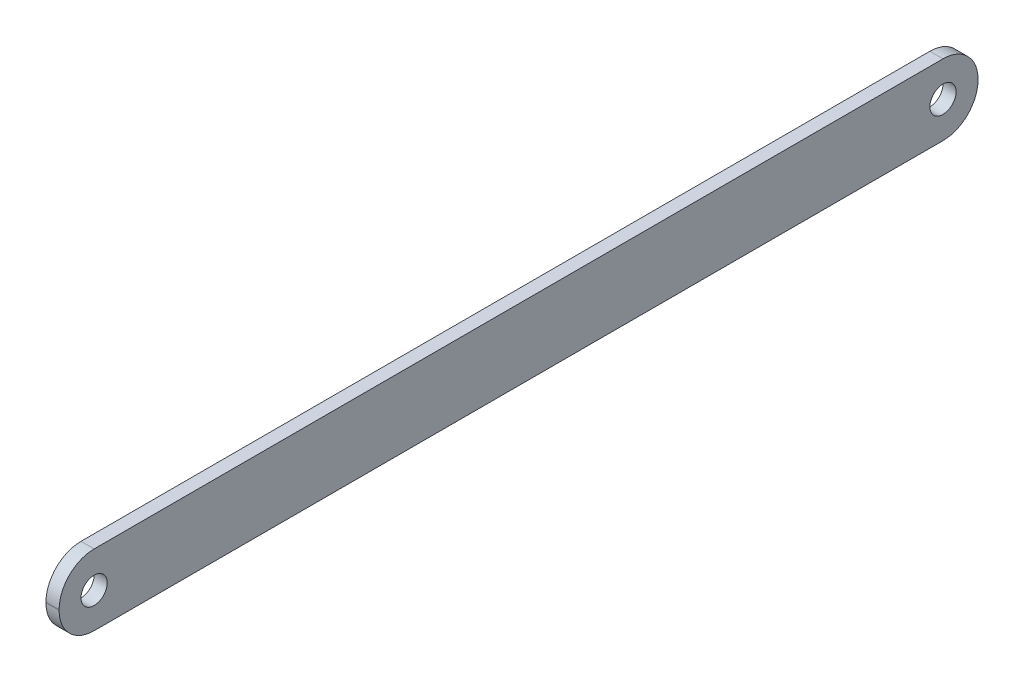
ISO-10303-21;
HEADER;
FILE_DESCRIPTION(('STEP AP214'),'2;1');
FILE_NAME('part.step','',(''),(''),'','','');
FILE_SCHEMA(('AUTOMOTIVE_DESIGN { 1 0 10303 214 1 1 1 1 }'));
ENDSEC;
DATA;
#1=APPLICATION_CONTEXT('core data for automotive mechanical design processes');
#2=APPLICATION_PROTOCOL_DEFINITION('international standard','automotive_design',2000,#1);
#3=PRODUCT_CONTEXT('',#1,'mechanical');
#4=PRODUCT('Part','Part','',(#3));
#5=PRODUCT_RELATED_PRODUCT_CATEGORY('part','',(#4));
#6=PRODUCT_DEFINITION_FORMATION('','',#4);
#7=PRODUCT_DEFINITION_CONTEXT('part definition',#1,'design');
#8=PRODUCT_DEFINITION('design','',#6,#7);
#9=PRODUCT_DEFINITION_SHAPE('','',#8);
#10=(LENGTH_UNIT() NAMED_UNIT(*) SI_UNIT(.MILLI.,.METRE.));
#11=(NAMED_UNIT(*) PLANE_ANGLE_UNIT() SI_UNIT($,.RADIAN.));
#12=(NAMED_UNIT(*) SI_UNIT($,.STERADIAN.) SOLID_ANGLE_UNIT());
#13=UNCERTAINTY_MEASURE_WITH_UNIT(LENGTH_MEASURE(1.E-05),#10,'distance_accuracy_value','');
#14=(GEOMETRIC_REPRESENTATION_CONTEXT(3) GLOBAL_UNCERTAINTY_ASSIGNED_CONTEXT((#13)) GLOBAL_UNIT_ASSIGNED_CONTEXT((#10,
#11,#12)) REPRESENTATION_CONTEXT('',''));
#15=CARTESIAN_POINT('',(0.,0.,0.));
#16=DIRECTION('',(0.,0.,1.));
#17=DIRECTION('',(1.,0.,0.));
#18=AXIS2_PLACEMENT_3D('',#15,#16,#17);
#19=CARTESIAN_POINT('',(3.,0.099999999999982,-96.9999999999999));
#20=DIRECTION('',(-1.,0.,0.));
#21=DIRECTION('',(0.,0.,1.));
#22=AXIS2_PLACEMENT_3D('',#19,#20,#21);
#23=PLANE('',#22);
#24=CARTESIAN_POINT('',(3.,0.099999999999982,-96.9999999999999));
#25=DIRECTION('',(1.,0.,0.));
#26=DIRECTION('',(0.,0.,1.));
#27=AXIS2_PLACEMENT_3D('',#24,#25,#26);
#28=CIRCLE('',#27,8.);
#29=CARTESIAN_POINT('',(3.,0.0999999999999317,-105.));
#30=VERTEX_POINT('',#29);
#31=CARTESIAN_POINT('',(3.,8.09999999999998,-96.9999999999999));
#32=VERTEX_POINT('',#31);
#33=EDGE_CURVE('E153',#30,#32,#28,.T.);
#34=ORIENTED_EDGE('',*,*,#33,.T.);
#35=DIRECTION('',(0.,0.,1.));
#36=VECTOR('',#35,1.);
#37=CARTESIAN_POINT('',(3.,8.09999999999998,97.));
#38=LINE('',#37,#36);
#39=CARTESIAN_POINT('',(3.,8.09999999999998,97.));
#40=VERTEX_POINT('',#39);
#41=EDGE_CURVE('E101',#32,#40,#38,.T.);
#42=ORIENTED_EDGE('',*,*,#41,.T.);
#43=CARTESIAN_POINT('',(3.,0.099999999999982,97.0000000000001));
#44=DIRECTION('',(1.,0.,0.));
#45=DIRECTION('',(0.,0.,-1.));
#46=AXIS2_PLACEMENT_3D('',#43,#44,#45);
#47=CIRCLE('',#46,8.);
#48=CARTESIAN_POINT('',(3.,0.099999999999912,105.));
#49=VERTEX_POINT('',#48);
#50=EDGE_CURVE('E168',#40,#49,#47,.T.);
#51=ORIENTED_EDGE('',*,*,#50,.T.);
#52=DIRECTION('',(0.,-1.,0.));
#53=VECTOR('',#52,1.);
#54=CARTESIAN_POINT('',(3.,0.0999999999999109,105.));
#55=LINE('',#54,#53);
#56=CARTESIAN_POINT('',(3.,-0.0999999999999595,105.));
#57=VERTEX_POINT('',#56);
#58=EDGE_CURVE('E181',#49,#57,#55,.T.);
#59=ORIENTED_EDGE('',*,*,#58,.T.);
#60=CARTESIAN_POINT('',(3.,-0.10000000000001,97.0000000000001));
#61=DIRECTION('',(1.,0.,0.));
#62=DIRECTION('',(0.,0.,-1.));
#63=AXIS2_PLACEMENT_3D('',#60,#61,#62);
#64=CIRCLE('',#63,8.);
#65=CARTESIAN_POINT('',(3.,-8.10000000000001,97.));
#66=VERTEX_POINT('',#65);
#67=EDGE_CURVE('E120',#57,#66,#64,.T.);
#68=ORIENTED_EDGE('',*,*,#67,.T.);
#69=DIRECTION('',(0.,0.,-1.));
#70=VECTOR('',#69,1.);
#71=CARTESIAN_POINT('',(3.,-8.10000000000001,97.));
#72=LINE('',#71,#70);
#73=CARTESIAN_POINT('',(3.,-8.10000000000001,-96.9999999999999));
#74=VERTEX_POINT('',#73);
#75=EDGE_CURVE('E114',#66,#74,#72,.T.);
#76=ORIENTED_EDGE('',*,*,#75,.T.);
#77=CARTESIAN_POINT('',(3.,-0.10000000000001,-96.9999999999999));
#78=DIRECTION('',(1.,0.,0.));
#79=DIRECTION('',(0.,0.,-1.));
#80=AXIS2_PLACEMENT_3D('',#77,#78,#79);
#81=CIRCLE('',#80,8.);
#82=CARTESIAN_POINT('',(3.,-0.10000000000001,-105.));
#83=VERTEX_POINT('',#82);
#84=EDGE_CURVE('E118',#74,#83,#81,.T.);
#85=ORIENTED_EDGE('',*,*,#84,.T.);
#86=DIRECTION('',(0.,1.,0.));
#87=VECTOR('',#86,1.);
#88=CARTESIAN_POINT('',(3.,0.0999999999999317,-105.));
#89=LINE('',#88,#87);
#90=EDGE_CURVE('E58',#83,#30,#89,.T.);
#91=ORIENTED_EDGE('',*,*,#90,.T.);
#92=EDGE_LOOP('',(#34,#42,#51,#59,#68,#76,#85,#91));
#93=FACE_BOUND('',#92,.T.);
#94=CARTESIAN_POINT('',(3.,-0.10000000000001,97.0000000000001));
#95=DIRECTION('',(1.,0.,0.));
#96=DIRECTION('',(0.,0.,-1.));
#97=AXIS2_PLACEMENT_3D('',#94,#95,#96);
#98=CIRCLE('',#97,3.00000000000001);
#99=CARTESIAN_POINT('',(3.,-0.10000000000001,94.0000000000001));
#100=VERTEX_POINT('',#99);
#101=EDGE_CURVE('E142',#100,#100,#98,.T.);
#102=ORIENTED_EDGE('',*,*,#101,.F.);
#103=EDGE_LOOP('',(#102));
#104=FACE_BOUND('',#103,.T.);
#105=CARTESIAN_POINT('',(3.,0.099999999999982,-96.9999999999999));
#106=DIRECTION('',(1.,0.,0.));
#107=DIRECTION('',(0.,0.,-1.));
#108=AXIS2_PLACEMENT_3D('',#105,#106,#107);
#109=CIRCLE('',#108,3.00000000000001);
#110=CARTESIAN_POINT('',(3.,0.099999999999982,-99.9999999999999));
#111=VERTEX_POINT('',#110);
#112=EDGE_CURVE('E190',#111,#111,#109,.T.);
#113=ORIENTED_EDGE('',*,*,#112,.F.);
#114=EDGE_LOOP('',(#113));
#115=FACE_BOUND('',#114,.T.);
#116=ADVANCED_FACE('F41',(#93,#104,#115),#23,.F.);
#117=CARTESIAN_POINT('',(0.,0.099999999999982,-96.9999999999999));
#118=DIRECTION('',(-1.,0.,0.));
#119=DIRECTION('',(0.,0.,1.));
#120=AXIS2_PLACEMENT_3D('',#117,#118,#119);
#121=PLANE('',#120);
#122=CARTESIAN_POINT('',(0.,-0.10000000000001,97.0000000000001));
#123=DIRECTION('',(1.,0.,0.));
#124=DIRECTION('',(0.,0.,-1.));
#125=AXIS2_PLACEMENT_3D('',#122,#123,#124);
#126=CIRCLE('',#125,3.00000000000001);
#127=CARTESIAN_POINT('',(0.,-0.10000000000001,94.0000000000001));
#128=VERTEX_POINT('',#127);
#129=EDGE_CURVE('E187',#128,#128,#126,.T.);
#130=ORIENTED_EDGE('',*,*,#129,.T.);
#131=EDGE_LOOP('',(#130));
#132=FACE_BOUND('',#131,.T.);
#133=CARTESIAN_POINT('',(0.,0.099999999999982,-96.9999999999999));
#134=DIRECTION('',(1.,0.,0.));
#135=DIRECTION('',(0.,0.,1.));
#136=AXIS2_PLACEMENT_3D('',#133,#134,#135);
#137=CIRCLE('',#136,8.);
#138=CARTESIAN_POINT('',(0.,0.0999999999999317,-105.));
#139=VERTEX_POINT('',#138);
#140=CARTESIAN_POINT('',(0.,8.09999999999998,-96.9999999999999));
#141=VERTEX_POINT('',#140);
#142=EDGE_CURVE('E138',#139,#141,#137,.T.);
#143=ORIENTED_EDGE('',*,*,#142,.F.);
#144=DIRECTION('',(0.,1.,0.));
#145=VECTOR('',#144,1.);
#146=CARTESIAN_POINT('',(0.,0.0999999999999317,-105.));
#147=LINE('',#146,#145);
#148=CARTESIAN_POINT('',(0.,-0.10000000000001,-105.));
#149=VERTEX_POINT('',#148);
#150=EDGE_CURVE('E93',#149,#139,#147,.T.);
#151=ORIENTED_EDGE('',*,*,#150,.F.);
#152=CARTESIAN_POINT('',(0.,-0.10000000000001,-96.9999999999999));
#153=DIRECTION('',(1.,0.,0.));
#154=DIRECTION('',(0.,0.,-1.));
#155=AXIS2_PLACEMENT_3D('',#152,#153,#154);
#156=CIRCLE('',#155,8.);
#157=CARTESIAN_POINT('',(0.,-8.10000000000001,-96.9999999999999));
#158=VERTEX_POINT('',#157);
#159=EDGE_CURVE('E87',#158,#149,#156,.T.);
#160=ORIENTED_EDGE('',*,*,#159,.F.);
#161=DIRECTION('',(0.,0.,-1.));
#162=VECTOR('',#161,1.);
#163=CARTESIAN_POINT('',(0.,-8.10000000000001,97.));
#164=LINE('',#163,#162);
#165=CARTESIAN_POINT('',(0.,-8.10000000000001,97.));
#166=VERTEX_POINT('',#165);
#167=EDGE_CURVE('E128',#166,#158,#164,.T.);
#168=ORIENTED_EDGE('',*,*,#167,.F.);
#169=CARTESIAN_POINT('',(0.,-0.10000000000001,97.0000000000001));
#170=DIRECTION('',(1.,0.,0.));
#171=DIRECTION('',(0.,0.,-1.));
#172=AXIS2_PLACEMENT_3D('',#169,#170,#171);
#173=CIRCLE('',#172,8.);
#174=CARTESIAN_POINT('',(0.,-0.0999999999999595,105.));
#175=VERTEX_POINT('',#174);
#176=EDGE_CURVE('E148',#175,#166,#173,.T.);
#177=ORIENTED_EDGE('',*,*,#176,.F.);
#178=DIRECTION('',(0.,-1.,0.));
#179=VECTOR('',#178,1.);
#180=CARTESIAN_POINT('',(0.,0.0999999999999109,105.));
#181=LINE('',#180,#179);
#182=CARTESIAN_POINT('',(0.,0.099999999999912,105.));
#183=VERTEX_POINT('',#182);
#184=EDGE_CURVE('E146',#183,#175,#181,.T.);
#185=ORIENTED_EDGE('',*,*,#184,.F.);
#186=CARTESIAN_POINT('',(0.,0.099999999999982,97.0000000000001));
#187=DIRECTION('',(1.,0.,0.));
#188=DIRECTION('',(0.,0.,-1.));
#189=AXIS2_PLACEMENT_3D('',#186,#187,#188);
#190=CIRCLE('',#189,8.);
#191=CARTESIAN_POINT('',(0.,8.09999999999998,97.));
#192=VERTEX_POINT('',#191);
#193=EDGE_CURVE('E144',#192,#183,#190,.T.);
#194=ORIENTED_EDGE('',*,*,#193,.F.);
#195=DIRECTION('',(0.,0.,1.));
#196=VECTOR('',#195,1.);
#197=CARTESIAN_POINT('',(0.,8.09999999999998,97.));
#198=LINE('',#197,#196);
#199=EDGE_CURVE('E141',#141,#192,#198,.T.);
#200=ORIENTED_EDGE('',*,*,#199,.F.);
#201=EDGE_LOOP('',(#143,#151,#160,#168,#177,#185,#194,#200));
#202=FACE_BOUND('',#201,.T.);
#203=CARTESIAN_POINT('',(0.,0.099999999999982,-96.9999999999999));
#204=DIRECTION('',(1.,0.,0.));
#205=DIRECTION('',(0.,0.,-1.));
#206=AXIS2_PLACEMENT_3D('',#203,#204,#205);
#207=CIRCLE('',#206,3.00000000000001);
#208=CARTESIAN_POINT('',(0.,0.099999999999982,-99.9999999999999));
#209=VERTEX_POINT('',#208);
#210=EDGE_CURVE('E193',#209,#209,#207,.T.);
#211=ORIENTED_EDGE('',*,*,#210,.T.);
#212=EDGE_LOOP('',(#211));
#213=FACE_BOUND('',#212,.T.);
#214=ADVANCED_FACE('F172',(#132,#202,#213),#121,.T.);
#215=CARTESIAN_POINT('',(3.,0.099999999999982,-96.9999999999999));
#216=DIRECTION('',(-1.,0.,0.));
#217=DIRECTION('',(0.,0.,1.));
#218=AXIS2_PLACEMENT_3D('',#215,#216,#217);
#219=CYLINDRICAL_SURFACE('',#218,8.);
#220=ORIENTED_EDGE('',*,*,#142,.T.);
#221=DIRECTION('',(-1.,0.,0.));
#222=VECTOR('',#221,1.);
#223=CARTESIAN_POINT('',(3.,8.09999999999998,-96.9999999999999));
#224=LINE('',#223,#222);
#225=EDGE_CURVE('E11',#32,#141,#224,.T.);
#226=ORIENTED_EDGE('',*,*,#225,.F.);
#227=ORIENTED_EDGE('',*,*,#33,.F.);
#228=DIRECTION('',(-1.,0.,0.));
#229=VECTOR('',#228,1.);
#230=CARTESIAN_POINT('',(3.,0.0999999999999317,-105.));
#231=LINE('',#230,#229);
#232=EDGE_CURVE('E134',#30,#139,#231,.T.);
#233=ORIENTED_EDGE('',*,*,#232,.T.);
#234=EDGE_LOOP('',(#220,#226,#227,#233));
#235=FACE_BOUND('',#234,.T.);
#236=ADVANCED_FACE('F43',(#235),#219,.T.);
#237=CARTESIAN_POINT('',(3.,8.09999999999998,97.));
#238=DIRECTION('',(0.,-1.,0.));
#239=DIRECTION('',(0.,0.,-1.));
#240=AXIS2_PLACEMENT_3D('',#237,#238,#239);
#241=PLANE('',#240);
#242=ORIENTED_EDGE('',*,*,#199,.T.);
#243=DIRECTION('',(-1.,0.,0.));
#244=VECTOR('',#243,1.);
#245=CARTESIAN_POINT('',(3.,8.09999999999998,97.));
#246=LINE('',#245,#244);
#247=EDGE_CURVE('E50',#40,#192,#246,.T.);
#248=ORIENTED_EDGE('',*,*,#247,.F.);
#249=ORIENTED_EDGE('',*,*,#41,.F.);
#250=ORIENTED_EDGE('',*,*,#225,.T.);
#251=EDGE_LOOP('',(#242,#248,#249,#250));
#252=FACE_BOUND('',#251,.T.);
#253=ADVANCED_FACE('F225',(#252),#241,.F.);
#254=CARTESIAN_POINT('',(3.,0.099999999999982,97.0000000000001));
#255=DIRECTION('',(-1.,0.,0.));
#256=DIRECTION('',(0.,0.,1.));
#257=AXIS2_PLACEMENT_3D('',#254,#255,#256);
#258=CYLINDRICAL_SURFACE('',#257,8.);
#259=ORIENTED_EDGE('',*,*,#193,.T.);
#260=DIRECTION('',(-1.,0.,0.));
#261=VECTOR('',#260,1.);
#262=CARTESIAN_POINT('',(3.,0.099999999999912,105.));
#263=LINE('',#262,#261);
#264=EDGE_CURVE('E160',#49,#183,#263,.T.);
#265=ORIENTED_EDGE('',*,*,#264,.F.);
#266=ORIENTED_EDGE('',*,*,#50,.F.);
#267=ORIENTED_EDGE('',*,*,#247,.T.);
#268=EDGE_LOOP('',(#259,#265,#266,#267));
#269=FACE_BOUND('',#268,.T.);
#270=ADVANCED_FACE('F166',(#269),#258,.T.);
#271=CARTESIAN_POINT('',(3.,0.0999999999999109,105.));
#272=DIRECTION('',(0.,0.,-1.));
#273=DIRECTION('',(-1.,0.,0.));
#274=AXIS2_PLACEMENT_3D('',#271,#272,#273);
#275=PLANE('',#274);
#276=ORIENTED_EDGE('',*,*,#184,.T.);
#277=DIRECTION('',(-1.,0.,0.));
#278=VECTOR('',#277,1.);
#279=CARTESIAN_POINT('',(3.,-0.0999999999999595,105.));
#280=LINE('',#279,#278);
#281=EDGE_CURVE('E157',#57,#175,#280,.T.);
#282=ORIENTED_EDGE('',*,*,#281,.F.);
#283=ORIENTED_EDGE('',*,*,#58,.F.);
#284=ORIENTED_EDGE('',*,*,#264,.T.);
#285=EDGE_LOOP('',(#276,#282,#283,#284));
#286=FACE_BOUND('',#285,.T.);
#287=ADVANCED_FACE('F177',(#286),#275,.F.);
#288=CARTESIAN_POINT('',(3.,-0.10000000000001,97.0000000000001));
#289=DIRECTION('',(-1.,0.,0.));
#290=DIRECTION('',(0.,0.,1.));
#291=AXIS2_PLACEMENT_3D('',#288,#289,#290);
#292=CYLINDRICAL_SURFACE('',#291,8.);
#293=ORIENTED_EDGE('',*,*,#176,.T.);
#294=DIRECTION('',(-1.,0.,0.));
#295=VECTOR('',#294,1.);
#296=CARTESIAN_POINT('',(3.,-8.10000000000001,97.));
#297=LINE('',#296,#295);
#298=EDGE_CURVE('E129',#66,#166,#297,.T.);
#299=ORIENTED_EDGE('',*,*,#298,.F.);
#300=ORIENTED_EDGE('',*,*,#67,.F.);
#301=ORIENTED_EDGE('',*,*,#281,.T.);
#302=EDGE_LOOP('',(#293,#299,#300,#301));
#303=FACE_BOUND('',#302,.T.);
#304=ADVANCED_FACE('F180',(#303),#292,.T.);
#305=CARTESIAN_POINT('',(3.,-8.10000000000001,97.));
#306=DIRECTION('',(0.,1.,0.));
#307=DIRECTION('',(0.,0.,1.));
#308=AXIS2_PLACEMENT_3D('',#305,#306,#307);
#309=PLANE('',#308);
#310=ORIENTED_EDGE('',*,*,#167,.T.);
#311=DIRECTION('',(-1.,0.,0.));
#312=VECTOR('',#311,1.);
#313=CARTESIAN_POINT('',(3.,-8.10000000000001,-96.9999999999999));
#314=LINE('',#313,#312);
#315=EDGE_CURVE('E125',#74,#158,#314,.T.);
#316=ORIENTED_EDGE('',*,*,#315,.F.);
#317=ORIENTED_EDGE('',*,*,#75,.F.);
#318=ORIENTED_EDGE('',*,*,#298,.T.);
#319=EDGE_LOOP('',(#310,#316,#317,#318));
#320=FACE_BOUND('',#319,.T.);
#321=ADVANCED_FACE('F126',(#320),#309,.F.);
#322=CARTESIAN_POINT('',(3.,-0.10000000000001,-96.9999999999999));
#323=DIRECTION('',(-1.,0.,0.));
#324=DIRECTION('',(0.,0.,1.));
#325=AXIS2_PLACEMENT_3D('',#322,#323,#324);
#326=CYLINDRICAL_SURFACE('',#325,8.);
#327=ORIENTED_EDGE('',*,*,#159,.T.);
#328=DIRECTION('',(-1.,0.,0.));
#329=VECTOR('',#328,1.);
#330=CARTESIAN_POINT('',(3.,-0.10000000000001,-105.));
#331=LINE('',#330,#329);
#332=EDGE_CURVE('E130',#83,#149,#331,.T.);
#333=ORIENTED_EDGE('',*,*,#332,.F.);
#334=ORIENTED_EDGE('',*,*,#84,.F.);
#335=ORIENTED_EDGE('',*,*,#315,.T.);
#336=EDGE_LOOP('',(#327,#333,#334,#335));
#337=FACE_BOUND('',#336,.T.);
#338=ADVANCED_FACE('F132',(#337),#326,.T.);
#339=CARTESIAN_POINT('',(3.,0.0999999999999317,-105.));
#340=DIRECTION('',(0.,0.,1.));
#341=DIRECTION('',(1.,0.,0.));
#342=AXIS2_PLACEMENT_3D('',#339,#340,#341);
#343=PLANE('',#342);
#344=ORIENTED_EDGE('',*,*,#150,.T.);
#345=ORIENTED_EDGE('',*,*,#232,.F.);
#346=ORIENTED_EDGE('',*,*,#90,.F.);
#347=ORIENTED_EDGE('',*,*,#332,.T.);
#348=EDGE_LOOP('',(#344,#345,#346,#347));
#349=FACE_BOUND('',#348,.T.);
#350=ADVANCED_FACE('F213',(#349),#343,.F.);
#351=CARTESIAN_POINT('',(3.,-0.10000000000001,97.0000000000001));
#352=DIRECTION('',(-1.,0.,0.));
#353=DIRECTION('',(0.,0.,1.));
#354=AXIS2_PLACEMENT_3D('',#351,#352,#353);
#355=CYLINDRICAL_SURFACE('',#354,3.00000000000001);
#356=ORIENTED_EDGE('',*,*,#101,.T.);
#357=EDGE_LOOP('',(#356));
#358=FACE_BOUND('',#357,.T.);
#359=ORIENTED_EDGE('',*,*,#129,.F.);
#360=EDGE_LOOP('',(#359));
#361=FACE_BOUND('',#360,.T.);
#362=ADVANCED_FACE('F210',(#358,#361),#355,.F.);
#363=CARTESIAN_POINT('',(3.,0.099999999999982,-96.9999999999999));
#364=DIRECTION('',(-1.,0.,0.));
#365=DIRECTION('',(0.,0.,1.));
#366=AXIS2_PLACEMENT_3D('',#363,#364,#365);
#367=CYLINDRICAL_SURFACE('',#366,3.00000000000001);
#368=ORIENTED_EDGE('',*,*,#112,.T.);
#369=EDGE_LOOP('',(#368));
#370=FACE_BOUND('',#369,.T.);
#371=ORIENTED_EDGE('',*,*,#210,.F.);
#372=EDGE_LOOP('',(#371));
#373=FACE_BOUND('',#372,.T.);
#374=ADVANCED_FACE('F199',(#370,#373),#367,.F.);
#375=CLOSED_SHELL('',(#116,#214,#236,#253,#270,#287,#304,#321,#338,#350,#362,#374));
#376=MANIFOLD_SOLID_BREP('B2',#375);
#377=ADVANCED_BREP_SHAPE_REPRESENTATION('',(#18,#376),#14);
#378=SHAPE_DEFINITION_REPRESENTATION(#9,#377);
ENDSEC;
END-ISO-10303-21;
